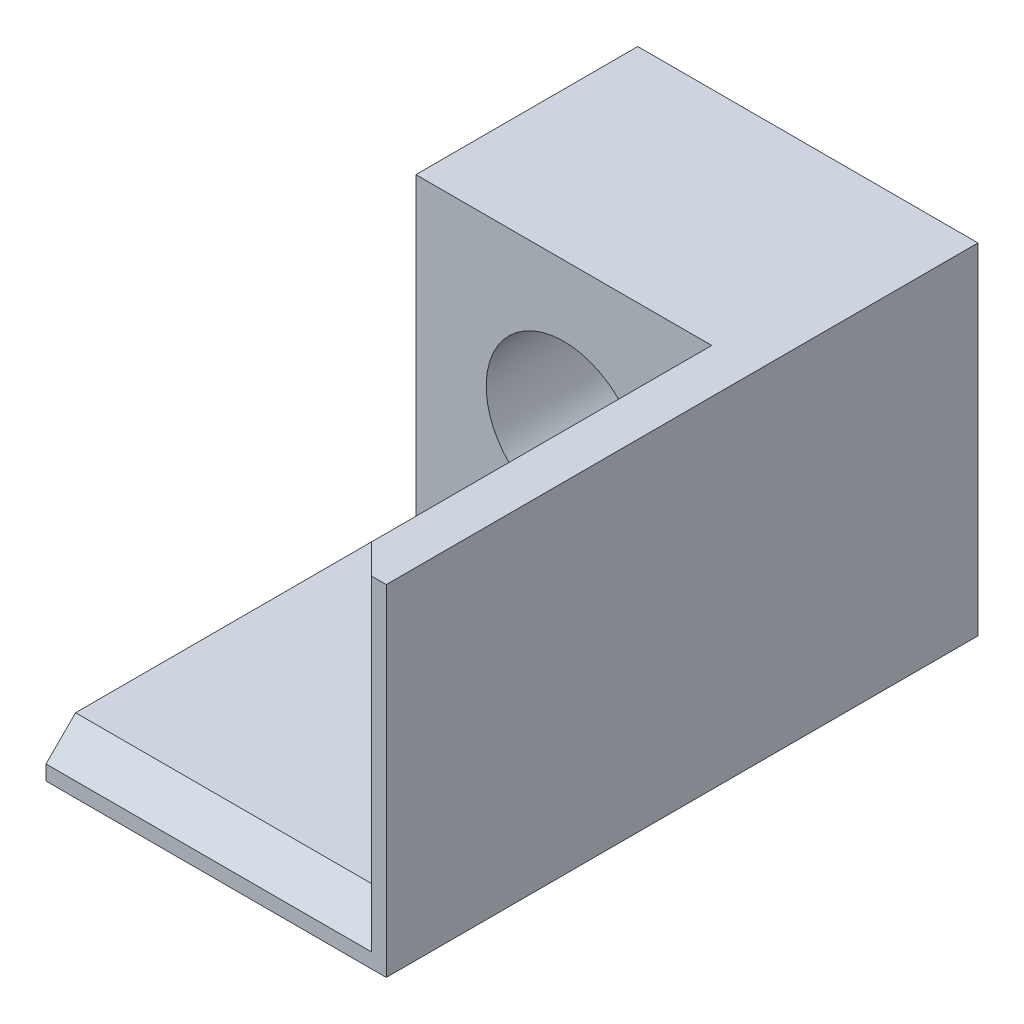
ISO-10303-21;
HEADER;
FILE_DESCRIPTION(('STEP AP214'),'2;1');
FILE_NAME('part.step','',(''),(''),'','','');
FILE_SCHEMA(('AUTOMOTIVE_DESIGN { 1 0 10303 214 1 1 1 1 }'));
ENDSEC;
DATA;
#1=APPLICATION_CONTEXT('core data for automotive mechanical design processes');
#2=APPLICATION_PROTOCOL_DEFINITION('international standard','automotive_design',2000,#1);
#3=PRODUCT_CONTEXT('',#1,'mechanical');
#4=PRODUCT('Part','Part','',(#3));
#5=PRODUCT_RELATED_PRODUCT_CATEGORY('part','',(#4));
#6=PRODUCT_DEFINITION_FORMATION('','',#4);
#7=PRODUCT_DEFINITION_CONTEXT('part definition',#1,'design');
#8=PRODUCT_DEFINITION('design','',#6,#7);
#9=PRODUCT_DEFINITION_SHAPE('','',#8);
#10=(LENGTH_UNIT() NAMED_UNIT(*) SI_UNIT(.MILLI.,.METRE.));
#11=(NAMED_UNIT(*) PLANE_ANGLE_UNIT() SI_UNIT($,.RADIAN.));
#12=(NAMED_UNIT(*) SI_UNIT($,.STERADIAN.) SOLID_ANGLE_UNIT());
#13=UNCERTAINTY_MEASURE_WITH_UNIT(LENGTH_MEASURE(1.E-05),#10,'distance_accuracy_value','');
#14=(GEOMETRIC_REPRESENTATION_CONTEXT(3) GLOBAL_UNCERTAINTY_ASSIGNED_CONTEXT((#13)) GLOBAL_UNIT_ASSIGNED_CONTEXT((#10,
#11,#12)) REPRESENTATION_CONTEXT('',''));
#15=CARTESIAN_POINT('',(0.,0.,0.));
#16=DIRECTION('',(0.,0.,1.));
#17=DIRECTION('',(1.,0.,0.));
#18=AXIS2_PLACEMENT_3D('',#15,#16,#17);
#19=CARTESIAN_POINT('',(-15.159709379077,13.0004724487662,2.49999947845936));
#20=DIRECTION('',(4.75817385492405E-10,-3.87094106768515E-10,1.));
#21=DIRECTION('',(1.,0.,-4.75817385492405E-10));
#22=AXIS2_PLACEMENT_3D('',#19,#20,#21);
#23=CYLINDRICAL_SURFACE('',#22,5.24393953942155);
#24=CARTESIAN_POINT('',(-15.1597093636129,13.0004724361857,35.0000001490116));
#25=DIRECTION('',(0.,0.,1.));
#26=DIRECTION('',(1.,0.,0.));
#27=AXIS2_PLACEMENT_3D('',#24,#25,#26);
#28=CIRCLE('',#27,5.24393953942155);
#29=CARTESIAN_POINT('',(-9.91576982419134,13.0004724361857,35.0000001490116));
#30=VERTEX_POINT('',#29);
#31=EDGE_CURVE('E12',#30,#30,#28,.F.);
#32=ORIENTED_EDGE('',*,*,#31,.F.);
#33=EDGE_LOOP('',(#32));
#34=FACE_BOUND('',#33,.T.);
#35=CARTESIAN_POINT('',(-15.1597093636165,13.0004724361884,22.499999999996));
#36=DIRECTION('',(1.59832686474633E-13,-1.22619940129569E-13,-1.));
#37=DIRECTION('',(-1.,0.,-1.59832686474633E-13));
#38=AXIS2_PLACEMENT_3D('',#35,#36,#37);
#39=CIRCLE('',#38,5.24393953942155);
#40=CARTESIAN_POINT('',(-20.403648903038,13.0004724361884,22.4999999999951));
#41=VERTEX_POINT('',#40);
#42=EDGE_CURVE('E386',#41,#41,#39,.T.);
#43=ORIENTED_EDGE('',*,*,#42,.T.);
#44=EDGE_LOOP('',(#43));
#45=FACE_BOUND('',#44,.T.);
#46=ADVANCED_FACE('F55',(#34,#45),#23,.F.);
#47=CARTESIAN_POINT('',(-25.1597091555595,11.5000009536743,29.9999993294477));
#48=DIRECTION('',(1.,0.,0.));
#49=DIRECTION('',(0.,0.,-1.));
#50=AXIS2_PLACEMENT_3D('',#47,#48,#49);
#51=PLANE('',#50);
#52=DIRECTION('',(0.,0.,-1.));
#53=VECTOR('',#52,1.);
#54=CARTESIAN_POINT('',(-25.1597091555595,23.0000019073486,29.9999993294477));
#55=LINE('',#54,#53);
#56=CARTESIAN_POINT('',(-25.1597091555595,23.0000019073486,35.0000001490116));
#57=VERTEX_POINT('',#56);
#58=CARTESIAN_POINT('',(-25.1597114838692,23.0000019073511,19.9999999999932));
#59=VERTEX_POINT('',#58);
#60=EDGE_CURVE('E196',#57,#59,#55,.T.);
#61=ORIENTED_EDGE('',*,*,#60,.T.);
#62=DIRECTION('',(-1.01230706237236E-07,0.999999999999995,-1.22619956309544E-13));
#63=VECTOR('',#62,1.);
#64=CARTESIAN_POINT('',(-25.1597114838692,23.0000019073511,19.9999999999932));
#65=LINE('',#64,#63);
#66=CARTESIAN_POINT('',(-25.1597091555627,2.45003205010477E-12,19.999999999996));
#67=VERTEX_POINT('',#66);
#68=EDGE_CURVE('E184',#67,#59,#65,.T.);
#69=ORIENTED_EDGE('',*,*,#68,.F.);
#70=DIRECTION('',(0.,0.,1.));
#71=VECTOR('',#70,1.);
#72=CARTESIAN_POINT('',(-25.1597091555595,0.,29.9999993294477));
#73=LINE('',#72,#71);
#74=CARTESIAN_POINT('',(-25.1597091555595,0.,59.9999986588955));
#75=VERTEX_POINT('',#74);
#76=EDGE_CURVE('E174',#75,#67,#73,.F.);
#77=ORIENTED_EDGE('',*,*,#76,.F.);
#78=DIRECTION('',(0.,1.,0.));
#79=VECTOR('',#78,1.);
#80=CARTESIAN_POINT('',(-25.1597091555595,11.5000009536743,59.9999986588955));
#81=LINE('',#80,#79);
#82=CARTESIAN_POINT('',(-25.1597091555595,1.00000392461526,59.9999986588955));
#83=VERTEX_POINT('',#82);
#84=EDGE_CURVE('E167',#83,#75,#81,.F.);
#85=ORIENTED_EDGE('',*,*,#84,.F.);
#86=DIRECTION('',(0.,0.70710620217265,-0.707107360199971));
#87=VECTOR('',#86,1.);
#88=CARTESIAN_POINT('',(-25.1597091555595,21.2499935059368,39.7499759141805));
#89=LINE('',#88,#87);
#90=CARTESIAN_POINT('',(-25.1597091555595,2.99999862909317,58.0000006790277));
#91=VERTEX_POINT('',#90);
#92=EDGE_CURVE('E160',#83,#91,#89,.T.);
#93=ORIENTED_EDGE('',*,*,#92,.T.);
#94=DIRECTION('',(0.,0.,1.));
#95=VECTOR('',#94,1.);
#96=CARTESIAN_POINT('',(-25.1597091555595,2.99999862909317,29.9999993294477));
#97=LINE('',#96,#95);
#98=CARTESIAN_POINT('',(-25.1597091555595,2.99999862909317,35.0000001490116));
#99=VERTEX_POINT('',#98);
#100=EDGE_CURVE('E81',#91,#99,#97,.F.);
#101=ORIENTED_EDGE('',*,*,#100,.T.);
#102=DIRECTION('',(0.,-1.,0.));
#103=VECTOR('',#102,1.);
#104=CARTESIAN_POINT('',(-25.1597091555595,11.5000009536743,35.0000001490116));
#105=LINE('',#104,#103);
#106=EDGE_CURVE('E207',#99,#57,#105,.F.);
#107=ORIENTED_EDGE('',*,*,#106,.T.);
#108=EDGE_LOOP('',(#61,#69,#77,#85,#93,#101,#107));
#109=FACE_BOUND('',#108,.T.);
#110=ADVANCED_FACE('F233',(#109),#51,.F.);
#111=CARTESIAN_POINT('',(-13.6597093660384,0.,29.9999993294477));
#112=DIRECTION('',(0.,-1.,0.));
#113=DIRECTION('',(1.,0.,0.));
#114=AXIS2_PLACEMENT_3D('',#111,#112,#113);
#115=PLANE('',#114);
#116=ORIENTED_EDGE('',*,*,#76,.T.);
#117=DIRECTION('',(-1.,0.,-1.59832686474633E-13));
#118=VECTOR('',#117,1.);
#119=CARTESIAN_POINT('',(-2.15970957652054,2.45003205010522E-12,19.9999999999997));
#120=LINE('',#119,#118);
#121=CARTESIAN_POINT('',(-2.15970957652054,2.45003205010522E-12,19.9999999999997));
#122=VERTEX_POINT('',#121);
#123=EDGE_CURVE('E186',#122,#67,#120,.T.);
#124=ORIENTED_EDGE('',*,*,#123,.F.);
#125=DIRECTION('',(0.,0.,1.));
#126=VECTOR('',#125,1.);
#127=CARTESIAN_POINT('',(-2.15970957651734,0.,29.9999993294477));
#128=LINE('',#127,#126);
#129=CARTESIAN_POINT('',(-2.15970957651734,0.,59.9999986588955));
#130=VERTEX_POINT('',#129);
#131=EDGE_CURVE('E172',#122,#130,#128,.T.);
#132=ORIENTED_EDGE('',*,*,#131,.T.);
#133=DIRECTION('',(1.,0.,0.));
#134=VECTOR('',#133,1.);
#135=CARTESIAN_POINT('',(-13.6597093660384,0.,59.9999986588955));
#136=LINE('',#135,#134);
#137=EDGE_CURVE('E193',#75,#130,#136,.T.);
#138=ORIENTED_EDGE('',*,*,#137,.F.);
#139=EDGE_LOOP('',(#116,#124,#132,#138));
#140=FACE_BOUND('',#139,.T.);
#141=ADVANCED_FACE('F229',(#140),#115,.T.);
#142=CARTESIAN_POINT('',(-13.6597093660384,23.0000019073486,29.9999993294477));
#143=DIRECTION('',(0.,-1.,0.));
#144=DIRECTION('',(0.,0.,-1.));
#145=AXIS2_PLACEMENT_3D('',#142,#143,#144);
#146=PLANE('',#145);
#147=DIRECTION('',(0.,0.,-1.));
#148=VECTOR('',#147,1.);
#149=CARTESIAN_POINT('',(-2.15970957651734,23.0000019073486,29.9999993294477));
#150=LINE('',#149,#148);
#151=CARTESIAN_POINT('',(-2.15970957651734,23.0000019073486,19.9999999999982));
#152=VERTEX_POINT('',#151);
#153=CARTESIAN_POINT('',(-2.15970957651734,23.0000019073486,59.9999986588955));
#154=VERTEX_POINT('',#153);
#155=EDGE_CURVE('E153',#152,#154,#150,.F.);
#156=ORIENTED_EDGE('',*,*,#155,.F.);
#157=DIRECTION('',(1.,0.,1.59832686474633E-13));
#158=VECTOR('',#157,1.);
#159=CARTESIAN_POINT('',(-2.15970957652054,23.0000019073511,19.9999999999968));
#160=LINE('',#159,#158);
#161=EDGE_CURVE('E72',#59,#152,#160,.T.);
#162=ORIENTED_EDGE('',*,*,#161,.F.);
#163=ORIENTED_EDGE('',*,*,#60,.F.);
#164=DIRECTION('',(-1.,0.,0.));
#165=VECTOR('',#164,1.);
#166=CARTESIAN_POINT('',(-13.6597093660384,23.0000019073486,35.0000001490116));
#167=LINE('',#166,#165);
#168=CARTESIAN_POINT('',(-5.15970960259438,23.0000019073486,35.0000001490116));
#169=VERTEX_POINT('',#168);
#170=EDGE_CURVE('E129',#57,#169,#167,.F.);
#171=ORIENTED_EDGE('',*,*,#170,.T.);
#172=DIRECTION('',(0.,0.,1.));
#173=VECTOR('',#172,1.);
#174=CARTESIAN_POINT('',(-5.15970960259438,23.0000019073486,29.9999993294477));
#175=LINE('',#174,#173);
#176=CARTESIAN_POINT('',(-5.15970960259438,23.0000019073486,57.9999988175348));
#177=VERTEX_POINT('',#176);
#178=EDGE_CURVE('E120',#169,#177,#175,.T.);
#179=ORIENTED_EDGE('',*,*,#178,.T.);
#180=DIRECTION('',(0.707106625738879,0.,0.707106936634182));
#181=VECTOR('',#180,1.);
#182=CARTESIAN_POINT('',(-23.4097073597511,23.0000019073486,39.7499930363568));
#183=LINE('',#182,#181);
#184=CARTESIAN_POINT('',(-3.15971064057813,23.0000019073486,59.9999986588955));
#185=VERTEX_POINT('',#184);
#186=EDGE_CURVE('E126',#177,#185,#183,.T.);
#187=ORIENTED_EDGE('',*,*,#186,.T.);
#188=DIRECTION('',(1.,0.,0.));
#189=VECTOR('',#188,1.);
#190=CARTESIAN_POINT('',(-13.6597093660384,23.0000019073486,59.9999986588955));
#191=LINE('',#190,#189);
#192=EDGE_CURVE('E134',#154,#185,#191,.F.);
#193=ORIENTED_EDGE('',*,*,#192,.F.);
#194=EDGE_LOOP('',(#156,#162,#163,#171,#179,#187,#193));
#195=FACE_BOUND('',#194,.T.);
#196=ADVANCED_FACE('F123',(#195),#146,.F.);
#197=CARTESIAN_POINT('',(-2.15970957651734,11.5000009536743,29.9999993294477));
#198=DIRECTION('',(1.,0.,0.));
#199=DIRECTION('',(0.,0.,-1.));
#200=AXIS2_PLACEMENT_3D('',#197,#198,#199);
#201=PLANE('',#200);
#202=ORIENTED_EDGE('',*,*,#131,.F.);
#203=DIRECTION('',(0.,-1.,1.22619940129569E-13));
#204=VECTOR('',#203,1.);
#205=CARTESIAN_POINT('',(-2.15970957652054,23.0000019073511,19.9999999999968));
#206=LINE('',#205,#204);
#207=EDGE_CURVE('E223',#152,#122,#206,.T.);
#208=ORIENTED_EDGE('',*,*,#207,.F.);
#209=ORIENTED_EDGE('',*,*,#155,.T.);
#210=DIRECTION('',(0.,-1.,0.));
#211=VECTOR('',#210,1.);
#212=CARTESIAN_POINT('',(-2.15970957651734,11.5000009536743,59.9999986588955));
#213=LINE('',#212,#211);
#214=EDGE_CURVE('E175',#154,#130,#213,.T.);
#215=ORIENTED_EDGE('',*,*,#214,.T.);
#216=EDGE_LOOP('',(#202,#208,#209,#215));
#217=FACE_BOUND('',#216,.T.);
#218=ADVANCED_FACE('F222',(#217),#201,.T.);
#219=CARTESIAN_POINT('',(-13.6597093660384,11.5000009536743,59.9999986588955));
#220=DIRECTION('',(0.,0.,1.));
#221=DIRECTION('',(1.,0.,0.));
#222=AXIS2_PLACEMENT_3D('',#219,#220,#221);
#223=PLANE('',#222);
#224=DIRECTION('',(-0.999999999999997,8.45846968709668E-08,0.));
#225=VECTOR('',#224,1.);
#226=CARTESIAN_POINT('',(-14.1597095325794,1.00000299418362,59.9999986588955));
#227=LINE('',#226,#225);
#228=CARTESIAN_POINT('',(-3.15971117329718,1.0000020637521,59.9999986588955));
#229=VERTEX_POINT('',#228);
#230=EDGE_CURVE('E64',#83,#229,#227,.F.);
#231=ORIENTED_EDGE('',*,*,#230,.F.);
#232=ORIENTED_EDGE('',*,*,#84,.T.);
#233=ORIENTED_EDGE('',*,*,#137,.T.);
#234=ORIENTED_EDGE('',*,*,#214,.F.);
#235=ORIENTED_EDGE('',*,*,#192,.T.);
#236=DIRECTION('',(-2.42145023377643E-08,-1.,0.));
#237=VECTOR('',#236,1.);
#238=CARTESIAN_POINT('',(-3.15971090693765,12.0000019427388,59.9999986588955));
#239=LINE('',#238,#237);
#240=EDGE_CURVE('E145',#229,#185,#239,.F.);
#241=ORIENTED_EDGE('',*,*,#240,.F.);
#242=EDGE_LOOP('',(#231,#232,#233,#234,#235,#241));
#243=FACE_BOUND('',#242,.T.);
#244=ADVANCED_FACE('F224',(#243),#223,.T.);
#245=CARTESIAN_POINT('',(-5.15970960259438,13.0000002682209,46.4999992400408));
#246=DIRECTION('',(1.,0.,0.));
#247=DIRECTION('',(0.,0.,-1.));
#248=AXIS2_PLACEMENT_3D('',#245,#246,#247);
#249=PLANE('',#248);
#250=ORIENTED_EDGE('',*,*,#178,.F.);
#251=DIRECTION('',(0.,1.,0.));
#252=VECTOR('',#251,1.);
#253=CARTESIAN_POINT('',(-5.15970960259438,13.0000002682209,35.0000001490116));
#254=LINE('',#253,#252);
#255=CARTESIAN_POINT('',(-5.15970960259438,2.99999862909317,35.0000001490116));
#256=VERTEX_POINT('',#255);
#257=EDGE_CURVE('E199',#169,#256,#254,.F.);
#258=ORIENTED_EDGE('',*,*,#257,.T.);
#259=DIRECTION('',(0.,0.,1.));
#260=VECTOR('',#259,1.);
#261=CARTESIAN_POINT('',(-5.15970960259438,2.99999862909317,46.4999992400408));
#262=LINE('',#261,#260);
#263=CARTESIAN_POINT('',(-5.15970975984135,2.99999847184636,57.9999991445781));
#264=VERTEX_POINT('',#263);
#265=EDGE_CURVE('E139',#264,#256,#262,.F.);
#266=ORIENTED_EDGE('',*,*,#265,.F.);
#267=DIRECTION('',(0.,-1.,2.42145129842139E-08));
#268=VECTOR('',#267,1.);
#269=CARTESIAN_POINT('',(-5.15970960259438,12.0000019427388,57.9999990838944));
#270=LINE('',#269,#268);
#271=EDGE_CURVE('E59',#177,#264,#270,.T.);
#272=ORIENTED_EDGE('',*,*,#271,.F.);
#273=EDGE_LOOP('',(#250,#258,#266,#272));
#274=FACE_BOUND('',#273,.T.);
#275=ADVANCED_FACE('F137',(#274),#249,.F.);
#276=CARTESIAN_POINT('',(-15.159709379077,2.99999862909317,46.4999992400408));
#277=DIRECTION('',(0.,1.,0.));
#278=DIRECTION('',(0.,0.,1.));
#279=AXIS2_PLACEMENT_3D('',#276,#277,#278);
#280=PLANE('',#279);
#281=ORIENTED_EDGE('',*,*,#100,.F.);
#282=DIRECTION('',(0.999999999999996,0.,-8.45848353952644E-08));
#283=VECTOR('',#282,1.);
#284=CARTESIAN_POINT('',(-14.1597095325796,2.99999862909317,57.9999997485945));
#285=LINE('',#284,#283);
#286=EDGE_CURVE('E156',#264,#91,#285,.F.);
#287=ORIENTED_EDGE('',*,*,#286,.F.);
#288=ORIENTED_EDGE('',*,*,#265,.T.);
#289=DIRECTION('',(-1.,0.,0.));
#290=VECTOR('',#289,1.);
#291=CARTESIAN_POINT('',(-15.159709379077,2.99999862909317,35.0000001490116));
#292=LINE('',#291,#290);
#293=EDGE_CURVE('E197',#256,#99,#292,.T.);
#294=ORIENTED_EDGE('',*,*,#293,.T.);
#295=EDGE_LOOP('',(#281,#287,#288,#294));
#296=FACE_BOUND('',#295,.T.);
#297=ADVANCED_FACE('F244',(#296),#280,.T.);
#298=CARTESIAN_POINT('',(-15.159709379077,13.0000002682209,35.0000001490116));
#299=DIRECTION('',(0.,0.,1.));
#300=DIRECTION('',(1.,0.,0.));
#301=AXIS2_PLACEMENT_3D('',#298,#299,#300);
#302=PLANE('',#301);
#303=ORIENTED_EDGE('',*,*,#293,.F.);
#304=ORIENTED_EDGE('',*,*,#257,.F.);
#305=ORIENTED_EDGE('',*,*,#170,.F.);
#306=ORIENTED_EDGE('',*,*,#106,.F.);
#307=EDGE_LOOP('',(#303,#304,#305,#306));
#308=FACE_BOUND('',#307,.T.);
#309=ORIENTED_EDGE('',*,*,#31,.T.);
#310=EDGE_LOOP('',(#309));
#311=FACE_BOUND('',#310,.T.);
#312=ADVANCED_FACE('F241',(#308,#311),#302,.T.);
#313=CARTESIAN_POINT('',(-14.1597094479949,2.0000009241135,58.9999990912697));
#314=DIRECTION('',(-5.98104617177442E-08,-0.70710736019997,-0.707106202172649));
#315=DIRECTION('',(0.,0.70710620217265,-0.707107360199971));
#316=AXIS2_PLACEMENT_3D('',#313,#314,#315);
#317=PLANE('',#316);
#318=ORIENTED_EDGE('',*,*,#92,.F.);
#319=ORIENTED_EDGE('',*,*,#230,.T.);
#320=DIRECTION('',(0.577350389536035,-0.577349760671137,0.577350657361339));
#321=VECTOR('',#320,1.);
#322=CARTESIAN_POINT('',(-7.49304500561201,5.33333117608823,55.6666628164037));
#323=LINE('',#322,#321);
#324=EDGE_CURVE('E150',#264,#229,#323,.T.);
#325=ORIENTED_EDGE('',*,*,#324,.F.);
#326=ORIENTED_EDGE('',*,*,#286,.T.);
#327=EDGE_LOOP('',(#318,#319,#325,#326));
#328=FACE_BOUND('',#327,.T.);
#329=ADVANCED_FACE('F251',(#328),#317,.F.);
#330=CARTESIAN_POINT('',(-4.15971015134538,12.0000019669533,58.9999989748156));
#331=DIRECTION('',(0.707106936634182,-1.71222425701778E-08,-0.707106625738878));
#332=DIRECTION('',(-0.707106625738879,0.,-0.707106936634182));
#333=AXIS2_PLACEMENT_3D('',#330,#331,#332);
#334=PLANE('',#333);
#335=ORIENTED_EDGE('',*,*,#186,.F.);
#336=ORIENTED_EDGE('',*,*,#271,.T.);
#337=ORIENTED_EDGE('',*,*,#324,.T.);
#338=ORIENTED_EDGE('',*,*,#240,.T.);
#339=EDGE_LOOP('',(#335,#336,#337,#338));
#340=FACE_BOUND('',#339,.T.);
#341=ADVANCED_FACE('F57',(#340),#334,.F.);
#342=CARTESIAN_POINT('',(-3.19665372949265E-12,2.45239880259139E-12,20.));
#343=DIRECTION('',(1.59832686474633E-13,-1.22619940129569E-13,-1.));
#344=DIRECTION('',(-1.,0.,-1.59832686474633E-13));
#345=AXIS2_PLACEMENT_3D('',#342,#343,#344);
#346=PLANE('',#345);
#347=ORIENTED_EDGE('',*,*,#207,.T.);
#348=ORIENTED_EDGE('',*,*,#123,.T.);
#349=ORIENTED_EDGE('',*,*,#68,.T.);
#350=ORIENTED_EDGE('',*,*,#161,.T.);
#351=EDGE_LOOP('',(#347,#348,#349,#350));
#352=FACE_BOUND('',#351,.T.);
#353=CARTESIAN_POINT('',(-15.1597093636161,13.0004724361881,19.999999999996));
#354=DIRECTION('',(1.59832686474633E-13,-1.22619940129569E-13,-1.));
#355=DIRECTION('',(-1.,0.,-1.59832686474633E-13));
#356=AXIS2_PLACEMENT_3D('',#353,#354,#355);
#357=CIRCLE('',#356,2.75);
#358=CARTESIAN_POINT('',(-17.9097093636161,13.0004724361881,19.9999999999955));
#359=VERTEX_POINT('',#358);
#360=EDGE_CURVE('E384',#359,#359,#357,.T.);
#361=ORIENTED_EDGE('',*,*,#360,.F.);
#362=EDGE_LOOP('',(#361));
#363=FACE_BOUND('',#362,.T.);
#364=ADVANCED_FACE('F237',(#352,#363),#346,.T.);
#365=CARTESIAN_POINT('',(-15.1597093636165,13.0004724361884,22.499999999996));
#366=DIRECTION('',(1.59832686474633E-13,-1.22619940129569E-13,-1.));
#367=DIRECTION('',(-1.,0.,-1.59832686474633E-13));
#368=AXIS2_PLACEMENT_3D('',#365,#366,#367);
#369=PLANE('',#368);
#370=CARTESIAN_POINT('',(-15.1597093636165,13.0004724361884,22.499999999996));
#371=DIRECTION('',(1.59832686474633E-13,-1.22619940129569E-13,-1.));
#372=DIRECTION('',(-1.,0.,-1.59832686474633E-13));
#373=AXIS2_PLACEMENT_3D('',#370,#371,#372);
#374=CIRCLE('',#373,2.75);
#375=CARTESIAN_POINT('',(-17.9097093636165,13.0004724361884,22.4999999999955));
#376=VERTEX_POINT('',#375);
#377=EDGE_CURVE('E381',#376,#376,#374,.T.);
#378=ORIENTED_EDGE('',*,*,#377,.T.);
#379=EDGE_LOOP('',(#378));
#380=FACE_BOUND('',#379,.T.);
#381=ORIENTED_EDGE('',*,*,#42,.F.);
#382=EDGE_LOOP('',(#381));
#383=FACE_BOUND('',#382,.T.);
#384=ADVANCED_FACE('F350',(#380,#383),#369,.F.);
#385=CARTESIAN_POINT('',(-15.1597093636165,13.0004724361884,22.499999999996));
#386=DIRECTION('',(1.59832686474633E-13,-1.22619940129569E-13,-1.));
#387=DIRECTION('',(-1.,0.,-1.59832686474633E-13));
#388=AXIS2_PLACEMENT_3D('',#385,#386,#387);
#389=CYLINDRICAL_SURFACE('',#388,2.75);
#390=ORIENTED_EDGE('',*,*,#377,.F.);
#391=EDGE_LOOP('',(#390));
#392=FACE_BOUND('',#391,.T.);
#393=ORIENTED_EDGE('',*,*,#360,.T.);
#394=EDGE_LOOP('',(#393));
#395=FACE_BOUND('',#394,.T.);
#396=ADVANCED_FACE('F364',(#392,#395),#389,.F.);
#397=CLOSED_SHELL('',(#46,#110,#141,#196,#218,#244,#275,#297,#312,#329,#341,#364,#384,#396));
#398=MANIFOLD_SOLID_BREP('B2',#397);
#399=ADVANCED_BREP_SHAPE_REPRESENTATION('',(#18,#398),#14);
#400=SHAPE_DEFINITION_REPRESENTATION(#9,#399);
ENDSEC;
END-ISO-10303-21;
